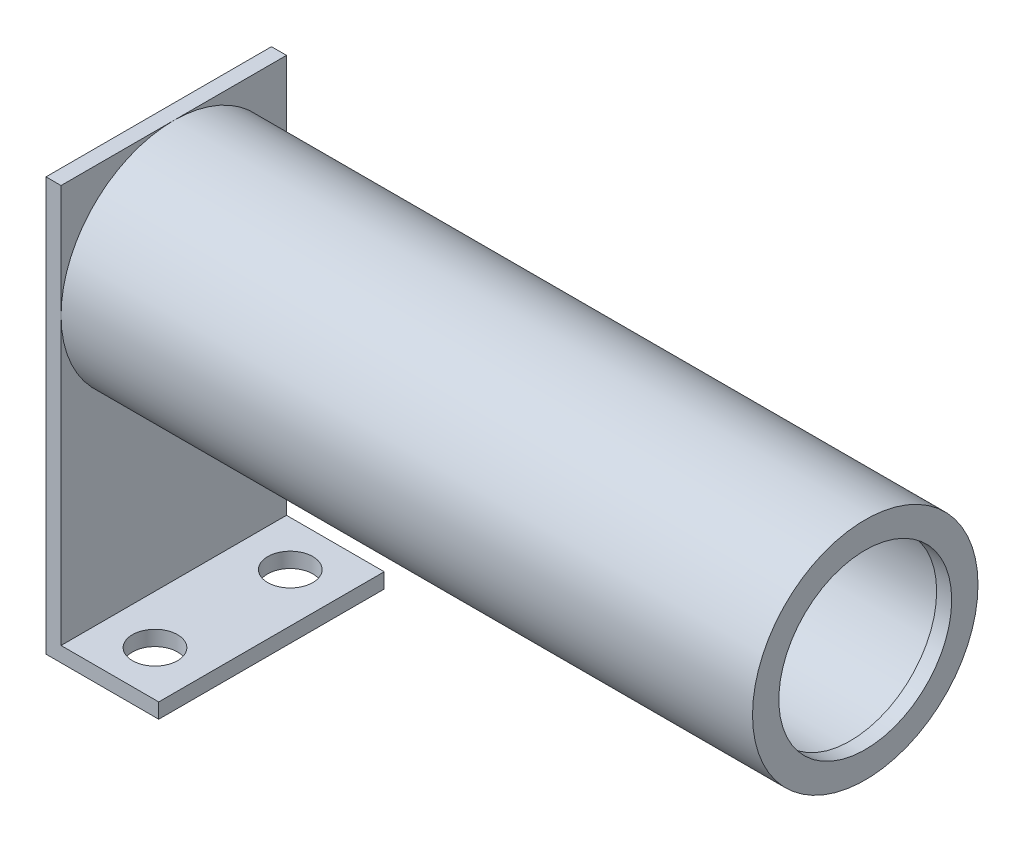
ISO-10303-21;
HEADER;
FILE_DESCRIPTION(('STEP AP214'),'2;1');
FILE_NAME('part.step','',(''),(''),'','','');
FILE_SCHEMA(('AUTOMOTIVE_DESIGN { 1 0 10303 214 1 1 1 1 }'));
ENDSEC;
DATA;
#1=APPLICATION_CONTEXT('core data for automotive mechanical design processes');
#2=APPLICATION_PROTOCOL_DEFINITION('international standard','automotive_design',2000,#1);
#3=PRODUCT_CONTEXT('',#1,'mechanical');
#4=PRODUCT('Part','Part','',(#3));
#5=PRODUCT_RELATED_PRODUCT_CATEGORY('part','',(#4));
#6=PRODUCT_DEFINITION_FORMATION('','',#4);
#7=PRODUCT_DEFINITION_CONTEXT('part definition',#1,'design');
#8=PRODUCT_DEFINITION('design','',#6,#7);
#9=PRODUCT_DEFINITION_SHAPE('','',#8);
#10=(LENGTH_UNIT() NAMED_UNIT(*) SI_UNIT(.MILLI.,.METRE.));
#11=(NAMED_UNIT(*) PLANE_ANGLE_UNIT() SI_UNIT($,.RADIAN.));
#12=(NAMED_UNIT(*) SI_UNIT($,.STERADIAN.) SOLID_ANGLE_UNIT());
#13=UNCERTAINTY_MEASURE_WITH_UNIT(LENGTH_MEASURE(1.E-05),#10,'distance_accuracy_value','');
#14=(GEOMETRIC_REPRESENTATION_CONTEXT(3) GLOBAL_UNCERTAINTY_ASSIGNED_CONTEXT((#13)) GLOBAL_UNIT_ASSIGNED_CONTEXT((#10,
#11,#12)) REPRESENTATION_CONTEXT('',''));
#15=CARTESIAN_POINT('',(0.,0.,0.));
#16=DIRECTION('',(0.,0.,1.));
#17=DIRECTION('',(1.,0.,0.));
#18=AXIS2_PLACEMENT_3D('',#15,#16,#17);
#19=CARTESIAN_POINT('',(-5.5,55.,-15.));
#20=DIRECTION('',(-1.,0.,0.));
#21=DIRECTION('',(0.,0.,1.));
#22=AXIS2_PLACEMENT_3D('',#19,#20,#21);
#23=PLANE('',#22);
#24=CARTESIAN_POINT('',(-5.5,40.,0.));
#25=DIRECTION('',(1.,0.,0.));
#26=DIRECTION('',(0.,0.,-1.));
#27=AXIS2_PLACEMENT_3D('',#24,#25,#26);
#28=CIRCLE('',#27,15.);
#29=CARTESIAN_POINT('',(-5.5,40.,15.));
#30=VERTEX_POINT('',#29);
#31=CARTESIAN_POINT('',(-5.50000000000001,40.,-15.));
#32=VERTEX_POINT('',#31);
#33=EDGE_CURVE('E124',#30,#32,#28,.T.);
#34=ORIENTED_EDGE('',*,*,#33,.F.);
#35=DIRECTION('',(0.,-1.,0.));
#36=VECTOR('',#35,1.);
#37=CARTESIAN_POINT('',(-5.5,55.,15.));
#38=LINE('',#37,#36);
#39=CARTESIAN_POINT('',(-5.5,2.,15.));
#40=VERTEX_POINT('',#39);
#41=EDGE_CURVE('E112',#30,#40,#38,.T.);
#42=ORIENTED_EDGE('',*,*,#41,.T.);
#43=DIRECTION('',(0.,0.,-1.));
#44=VECTOR('',#43,1.);
#45=CARTESIAN_POINT('',(-5.5,2.,-15.));
#46=LINE('',#45,#44);
#47=CARTESIAN_POINT('',(-5.5,2.,-15.));
#48=VERTEX_POINT('',#47);
#49=EDGE_CURVE('E139',#40,#48,#46,.T.);
#50=ORIENTED_EDGE('',*,*,#49,.T.);
#51=DIRECTION('',(0.,-1.,0.));
#52=VECTOR('',#51,1.);
#53=CARTESIAN_POINT('',(-5.5,55.,-15.));
#54=LINE('',#53,#52);
#55=EDGE_CURVE('E125',#32,#48,#54,.T.);
#56=ORIENTED_EDGE('',*,*,#55,.F.);
#57=EDGE_LOOP('',(#34,#42,#50,#56));
#58=FACE_BOUND('',#57,.T.);
#59=ADVANCED_FACE('F40',(#58),#23,.F.);
#60=CARTESIAN_POINT('',(-5.5,55.,0.));
#61=VERTEX_POINT('',#60);
#62=EDGE_CURVE('E57',#32,#61,#28,.T.);
#63=ORIENTED_EDGE('',*,*,#62,.F.);
#64=CARTESIAN_POINT('',(-5.5,55.,-15.));
#65=VERTEX_POINT('',#64);
#66=EDGE_CURVE('E122',#65,#32,#54,.T.);
#67=ORIENTED_EDGE('',*,*,#66,.F.);
#68=DIRECTION('',(0.,0.,-1.));
#69=VECTOR('',#68,1.);
#70=CARTESIAN_POINT('',(-5.5,55.,-15.));
#71=LINE('',#70,#69);
#72=EDGE_CURVE('E141',#61,#65,#71,.T.);
#73=ORIENTED_EDGE('',*,*,#72,.F.);
#74=EDGE_LOOP('',(#63,#67,#73));
#75=FACE_BOUND('',#74,.T.);
#76=ADVANCED_FACE('F218',(#75),#23,.F.);
#77=CARTESIAN_POINT('',(-7.5,2.,15.));
#78=DIRECTION('',(1.,0.,0.));
#79=DIRECTION('',(0.,0.,-1.));
#80=AXIS2_PLACEMENT_3D('',#77,#78,#79);
#81=PLANE('',#80);
#82=DIRECTION('',(0.,0.,1.));
#83=VECTOR('',#82,1.);
#84=CARTESIAN_POINT('',(-7.5,0.,15.));
#85=LINE('',#84,#83);
#86=CARTESIAN_POINT('',(-7.5,0.,-15.));
#87=VERTEX_POINT('',#86);
#88=CARTESIAN_POINT('',(-7.5,0.,15.));
#89=VERTEX_POINT('',#88);
#90=EDGE_CURVE('E111',#87,#89,#85,.T.);
#91=ORIENTED_EDGE('',*,*,#90,.T.);
#92=DIRECTION('',(0.,-1.,0.));
#93=VECTOR('',#92,1.);
#94=CARTESIAN_POINT('',(-7.5,2.,15.));
#95=LINE('',#94,#93);
#96=CARTESIAN_POINT('',(-7.5,55.,15.));
#97=VERTEX_POINT('',#96);
#98=EDGE_CURVE('E11',#97,#89,#95,.T.);
#99=ORIENTED_EDGE('',*,*,#98,.F.);
#100=DIRECTION('',(0.,0.,1.));
#101=VECTOR('',#100,1.);
#102=CARTESIAN_POINT('',(-7.5,55.,15.));
#103=LINE('',#102,#101);
#104=CARTESIAN_POINT('',(-7.5,55.,-15.));
#105=VERTEX_POINT('',#104);
#106=EDGE_CURVE('E135',#105,#97,#103,.T.);
#107=ORIENTED_EDGE('',*,*,#106,.F.);
#108=DIRECTION('',(0.,-1.,0.));
#109=VECTOR('',#108,1.);
#110=CARTESIAN_POINT('',(-7.5,2.,-15.));
#111=LINE('',#110,#109);
#112=EDGE_CURVE('E155',#105,#87,#111,.T.);
#113=ORIENTED_EDGE('',*,*,#112,.T.);
#114=EDGE_LOOP('',(#91,#99,#107,#113));
#115=FACE_BOUND('',#114,.T.);
#116=ADVANCED_FACE('F42',(#115),#81,.F.);
#117=CARTESIAN_POINT('',(7.5,2.,15.));
#118=DIRECTION('',(0.,0.,-1.));
#119=DIRECTION('',(-1.,0.,0.));
#120=AXIS2_PLACEMENT_3D('',#117,#118,#119);
#121=PLANE('',#120);
#122=DIRECTION('',(1.,0.,0.));
#123=VECTOR('',#122,1.);
#124=CARTESIAN_POINT('',(7.5,0.,15.));
#125=LINE('',#124,#123);
#126=CARTESIAN_POINT('',(7.5,0.,15.));
#127=VERTEX_POINT('',#126);
#128=EDGE_CURVE('E158',#89,#127,#125,.T.);
#129=ORIENTED_EDGE('',*,*,#128,.T.);
#130=DIRECTION('',(0.,-1.,0.));
#131=VECTOR('',#130,1.);
#132=CARTESIAN_POINT('',(7.5,2.,15.));
#133=LINE('',#132,#131);
#134=CARTESIAN_POINT('',(7.5,2.,15.));
#135=VERTEX_POINT('',#134);
#136=EDGE_CURVE('E49',#135,#127,#133,.T.);
#137=ORIENTED_EDGE('',*,*,#136,.F.);
#138=DIRECTION('',(1.,0.,0.));
#139=VECTOR('',#138,1.);
#140=CARTESIAN_POINT('',(7.5,2.,15.));
#141=LINE('',#140,#139);
#142=EDGE_CURVE('E118',#40,#135,#141,.T.);
#143=ORIENTED_EDGE('',*,*,#142,.F.);
#144=ORIENTED_EDGE('',*,*,#41,.F.);
#145=CARTESIAN_POINT('',(-5.5,55.,15.));
#146=VERTEX_POINT('',#145);
#147=EDGE_CURVE('E104',#146,#30,#38,.T.);
#148=ORIENTED_EDGE('',*,*,#147,.F.);
#149=DIRECTION('',(1.,0.,0.));
#150=VECTOR('',#149,1.);
#151=CARTESIAN_POINT('',(-5.5,55.,15.));
#152=LINE('',#151,#150);
#153=EDGE_CURVE('E138',#97,#146,#152,.T.);
#154=ORIENTED_EDGE('',*,*,#153,.F.);
#155=ORIENTED_EDGE('',*,*,#98,.T.);
#156=EDGE_LOOP('',(#129,#137,#143,#144,#148,#154,#155));
#157=FACE_BOUND('',#156,.T.);
#158=ADVANCED_FACE('F116',(#157),#121,.F.);
#159=CARTESIAN_POINT('',(7.5,2.,15.));
#160=DIRECTION('',(-1.,0.,0.));
#161=DIRECTION('',(0.,0.,1.));
#162=AXIS2_PLACEMENT_3D('',#159,#160,#161);
#163=PLANE('',#162);
#164=DIRECTION('',(0.,0.,-1.));
#165=VECTOR('',#164,1.);
#166=CARTESIAN_POINT('',(7.5,0.,15.));
#167=LINE('',#166,#165);
#168=CARTESIAN_POINT('',(7.5,0.,-15.));
#169=VERTEX_POINT('',#168);
#170=EDGE_CURVE('E160',#127,#169,#167,.T.);
#171=ORIENTED_EDGE('',*,*,#170,.T.);
#172=DIRECTION('',(0.,-1.,0.));
#173=VECTOR('',#172,1.);
#174=CARTESIAN_POINT('',(7.5,2.,-15.));
#175=LINE('',#174,#173);
#176=CARTESIAN_POINT('',(7.5,2.,-15.));
#177=VERTEX_POINT('',#176);
#178=EDGE_CURVE('E165',#177,#169,#175,.T.);
#179=ORIENTED_EDGE('',*,*,#178,.F.);
#180=DIRECTION('',(0.,0.,-1.));
#181=VECTOR('',#180,1.);
#182=CARTESIAN_POINT('',(7.5,2.,15.));
#183=LINE('',#182,#181);
#184=EDGE_CURVE('E149',#135,#177,#183,.T.);
#185=ORIENTED_EDGE('',*,*,#184,.F.);
#186=ORIENTED_EDGE('',*,*,#136,.T.);
#187=EDGE_LOOP('',(#171,#179,#185,#186));
#188=FACE_BOUND('',#187,.T.);
#189=ADVANCED_FACE('F312',(#188),#163,.F.);
#190=CARTESIAN_POINT('',(7.5,2.,-15.));
#191=DIRECTION('',(0.,0.,1.));
#192=DIRECTION('',(1.,0.,0.));
#193=AXIS2_PLACEMENT_3D('',#190,#191,#192);
#194=PLANE('',#193);
#195=DIRECTION('',(-1.,0.,0.));
#196=VECTOR('',#195,1.);
#197=CARTESIAN_POINT('',(7.5,0.,-15.));
#198=LINE('',#197,#196);
#199=EDGE_CURVE('E150',#169,#87,#198,.T.);
#200=ORIENTED_EDGE('',*,*,#199,.T.);
#201=ORIENTED_EDGE('',*,*,#112,.F.);
#202=DIRECTION('',(-1.,0.,0.));
#203=VECTOR('',#202,1.);
#204=CARTESIAN_POINT('',(-7.5,55.,-15.));
#205=LINE('',#204,#203);
#206=EDGE_CURVE('E143',#65,#105,#205,.T.);
#207=ORIENTED_EDGE('',*,*,#206,.F.);
#208=ORIENTED_EDGE('',*,*,#66,.T.);
#209=ORIENTED_EDGE('',*,*,#55,.T.);
#210=DIRECTION('',(-1.,0.,0.));
#211=VECTOR('',#210,1.);
#212=CARTESIAN_POINT('',(7.5,2.,-15.));
#213=LINE('',#212,#211);
#214=EDGE_CURVE('E152',#177,#48,#213,.T.);
#215=ORIENTED_EDGE('',*,*,#214,.F.);
#216=ORIENTED_EDGE('',*,*,#178,.T.);
#217=EDGE_LOOP('',(#200,#201,#207,#208,#209,#215,#216));
#218=FACE_BOUND('',#217,.T.);
#219=ADVANCED_FACE('F307',(#218),#194,.F.);
#220=CARTESIAN_POINT('',(0.,2.,0.));
#221=DIRECTION('',(0.,1.,0.));
#222=DIRECTION('',(0.,0.,1.));
#223=AXIS2_PLACEMENT_3D('',#220,#221,#222);
#224=PLANE('',#223);
#225=CARTESIAN_POINT('',(1.,2.,9.00000000000001));
#226=DIRECTION('',(0.,1.,0.));
#227=DIRECTION('',(0.,0.,1.));
#228=AXIS2_PLACEMENT_3D('',#225,#226,#227);
#229=CIRCLE('',#228,3.);
#230=CARTESIAN_POINT('',(1.,2.,12.));
#231=VERTEX_POINT('',#230);
#232=EDGE_CURVE('E171',#231,#231,#229,.T.);
#233=ORIENTED_EDGE('',*,*,#232,.F.);
#234=EDGE_LOOP('',(#233));
#235=FACE_BOUND('',#234,.T.);
#236=CARTESIAN_POINT('',(1.,2.,-9.00000000000001));
#237=DIRECTION('',(0.,1.,0.));
#238=DIRECTION('',(0.,0.,-1.));
#239=AXIS2_PLACEMENT_3D('',#236,#237,#238);
#240=CIRCLE('',#239,3.);
#241=CARTESIAN_POINT('',(1.,2.,-12.));
#242=VERTEX_POINT('',#241);
#243=EDGE_CURVE('E177',#242,#242,#240,.T.);
#244=ORIENTED_EDGE('',*,*,#243,.F.);
#245=EDGE_LOOP('',(#244));
#246=FACE_BOUND('',#245,.T.);
#247=ORIENTED_EDGE('',*,*,#49,.F.);
#248=ORIENTED_EDGE('',*,*,#142,.T.);
#249=ORIENTED_EDGE('',*,*,#184,.T.);
#250=ORIENTED_EDGE('',*,*,#214,.T.);
#251=EDGE_LOOP('',(#247,#248,#249,#250));
#252=FACE_BOUND('',#251,.T.);
#253=ADVANCED_FACE('F233',(#235,#246,#252),#224,.T.);
#254=CARTESIAN_POINT('',(0.,0.,0.));
#255=DIRECTION('',(0.,1.,0.));
#256=DIRECTION('',(0.,0.,1.));
#257=AXIS2_PLACEMENT_3D('',#254,#255,#256);
#258=PLANE('',#257);
#259=CARTESIAN_POINT('',(1.,0.,9.00000000000001));
#260=DIRECTION('',(0.,1.,0.));
#261=DIRECTION('',(0.,0.,1.));
#262=AXIS2_PLACEMENT_3D('',#259,#260,#261);
#263=CIRCLE('',#262,3.);
#264=CARTESIAN_POINT('',(1.,0.,12.));
#265=VERTEX_POINT('',#264);
#266=EDGE_CURVE('E44',#265,#265,#263,.T.);
#267=ORIENTED_EDGE('',*,*,#266,.T.);
#268=EDGE_LOOP('',(#267));
#269=FACE_BOUND('',#268,.T.);
#270=CARTESIAN_POINT('',(1.,0.,-9.00000000000001));
#271=DIRECTION('',(0.,1.,0.));
#272=DIRECTION('',(0.,0.,1.));
#273=AXIS2_PLACEMENT_3D('',#270,#271,#272);
#274=CIRCLE('',#273,3.);
#275=CARTESIAN_POINT('',(1.,0.,-6.00000000000001));
#276=VERTEX_POINT('',#275);
#277=EDGE_CURVE('E169',#276,#276,#274,.T.);
#278=ORIENTED_EDGE('',*,*,#277,.T.);
#279=EDGE_LOOP('',(#278));
#280=FACE_BOUND('',#279,.T.);
#281=ORIENTED_EDGE('',*,*,#90,.F.);
#282=ORIENTED_EDGE('',*,*,#199,.F.);
#283=ORIENTED_EDGE('',*,*,#170,.F.);
#284=ORIENTED_EDGE('',*,*,#128,.F.);
#285=EDGE_LOOP('',(#281,#282,#283,#284));
#286=FACE_BOUND('',#285,.T.);
#287=ADVANCED_FACE('F227',(#269,#280,#286),#258,.F.);
#288=EDGE_CURVE('E65',#61,#30,#28,.T.);
#289=ORIENTED_EDGE('',*,*,#288,.F.);
#290=EDGE_CURVE('E108',#146,#61,#71,.T.);
#291=ORIENTED_EDGE('',*,*,#290,.F.);
#292=ORIENTED_EDGE('',*,*,#147,.T.);
#293=EDGE_LOOP('',(#289,#291,#292));
#294=FACE_BOUND('',#293,.T.);
#295=ADVANCED_FACE('F106',(#294),#23,.F.);
#296=CARTESIAN_POINT('',(0.,55.,0.));
#297=DIRECTION('',(0.,-1.,0.));
#298=DIRECTION('',(0.,0.,-1.));
#299=AXIS2_PLACEMENT_3D('',#296,#297,#298);
#300=PLANE('',#299);
#301=ORIENTED_EDGE('',*,*,#106,.T.);
#302=ORIENTED_EDGE('',*,*,#153,.T.);
#303=ORIENTED_EDGE('',*,*,#290,.T.);
#304=ORIENTED_EDGE('',*,*,#72,.T.);
#305=ORIENTED_EDGE('',*,*,#206,.T.);
#306=EDGE_LOOP('',(#301,#302,#303,#304,#305));
#307=FACE_BOUND('',#306,.T.);
#308=ADVANCED_FACE('F226',(#307),#300,.F.);
#309=CARTESIAN_POINT('',(86.5,40.,0.));
#310=DIRECTION('',(1.,0.,0.));
#311=DIRECTION('',(0.,0.,-1.));
#312=AXIS2_PLACEMENT_3D('',#309,#310,#311);
#313=PLANE('',#312);
#314=CARTESIAN_POINT('',(86.5,40.,0.));
#315=DIRECTION('',(1.,0.,0.));
#316=DIRECTION('',(0.,0.,-1.));
#317=AXIS2_PLACEMENT_3D('',#314,#315,#316);
#318=CIRCLE('',#317,15.);
#319=CARTESIAN_POINT('',(86.5,40.,-15.));
#320=VERTEX_POINT('',#319);
#321=EDGE_CURVE('E131',#320,#320,#318,.T.);
#322=ORIENTED_EDGE('',*,*,#321,.T.);
#323=EDGE_LOOP('',(#322));
#324=FACE_BOUND('',#323,.T.);
#325=CARTESIAN_POINT('',(86.5,40.,0.));
#326=DIRECTION('',(1.,0.,0.));
#327=DIRECTION('',(0.,0.,-1.));
#328=AXIS2_PLACEMENT_3D('',#325,#326,#327);
#329=CIRCLE('',#328,11.5);
#330=CARTESIAN_POINT('',(86.5,40.,-11.5));
#331=VERTEX_POINT('',#330);
#332=EDGE_CURVE('E175',#331,#331,#329,.T.);
#333=ORIENTED_EDGE('',*,*,#332,.F.);
#334=EDGE_LOOP('',(#333));
#335=FACE_BOUND('',#334,.T.);
#336=ADVANCED_FACE('F214',(#324,#335),#313,.T.);
#337=CARTESIAN_POINT('',(86.5,40.,0.));
#338=DIRECTION('',(-1.,0.,0.));
#339=DIRECTION('',(0.,0.,1.));
#340=AXIS2_PLACEMENT_3D('',#337,#338,#339);
#341=CYLINDRICAL_SURFACE('',#340,15.);
#342=ORIENTED_EDGE('',*,*,#321,.F.);
#343=EDGE_LOOP('',(#342));
#344=FACE_BOUND('',#343,.T.);
#345=ORIENTED_EDGE('',*,*,#62,.T.);
#346=ORIENTED_EDGE('',*,*,#288,.T.);
#347=ORIENTED_EDGE('',*,*,#33,.T.);
#348=EDGE_LOOP('',(#345,#346,#347));
#349=FACE_BOUND('',#348,.T.);
#350=ADVANCED_FACE('F130',(#344,#349),#341,.T.);
#351=CARTESIAN_POINT('',(84.5,40.,0.));
#352=DIRECTION('',(1.,0.,0.));
#353=DIRECTION('',(0.,0.,-1.));
#354=AXIS2_PLACEMENT_3D('',#351,#352,#353);
#355=PLANE('',#354);
#356=CARTESIAN_POINT('',(84.5,40.,0.));
#357=DIRECTION('',(1.,0.,0.));
#358=DIRECTION('',(0.,0.,-1.));
#359=AXIS2_PLACEMENT_3D('',#356,#357,#358);
#360=CIRCLE('',#359,11.5);
#361=CARTESIAN_POINT('',(84.5,40.,-11.5));
#362=VERTEX_POINT('',#361);
#363=EDGE_CURVE('E184',#362,#362,#360,.T.);
#364=ORIENTED_EDGE('',*,*,#363,.T.);
#365=EDGE_LOOP('',(#364));
#366=FACE_BOUND('',#365,.T.);
#367=CARTESIAN_POINT('',(84.5,40.,0.));
#368=DIRECTION('',(1.,0.,0.));
#369=DIRECTION('',(0.,0.,-1.));
#370=AXIS2_PLACEMENT_3D('',#367,#368,#369);
#371=CIRCLE('',#370,12.5);
#372=CARTESIAN_POINT('',(84.5,40.,-12.5));
#373=VERTEX_POINT('',#372);
#374=EDGE_CURVE('E187',#373,#373,#371,.T.);
#375=ORIENTED_EDGE('',*,*,#374,.F.);
#376=EDGE_LOOP('',(#375));
#377=FACE_BOUND('',#376,.T.);
#378=ADVANCED_FACE('F203',(#366,#377),#355,.F.);
#379=CARTESIAN_POINT('',(84.5,40.,0.));
#380=DIRECTION('',(1.,0.,0.));
#381=DIRECTION('',(0.,0.,-1.));
#382=AXIS2_PLACEMENT_3D('',#379,#380,#381);
#383=CYLINDRICAL_SURFACE('',#382,11.5);
#384=ORIENTED_EDGE('',*,*,#363,.F.);
#385=EDGE_LOOP('',(#384));
#386=FACE_BOUND('',#385,.T.);
#387=ORIENTED_EDGE('',*,*,#332,.T.);
#388=EDGE_LOOP('',(#387));
#389=FACE_BOUND('',#388,.T.);
#390=ADVANCED_FACE('F205',(#386,#389),#383,.F.);
#391=CARTESIAN_POINT('',(-5.5,40.,0.));
#392=DIRECTION('',(1.,0.,0.));
#393=DIRECTION('',(0.,0.,-1.));
#394=AXIS2_PLACEMENT_3D('',#391,#392,#393);
#395=CIRCLE('',#394,12.5);
#396=CARTESIAN_POINT('',(-5.5,40.,-12.5));
#397=VERTEX_POINT('',#396);
#398=EDGE_CURVE('E128',#397,#397,#395,.T.);
#399=ORIENTED_EDGE('',*,*,#398,.T.);
#400=EDGE_LOOP('',(#399));
#401=FACE_BOUND('',#400,.T.);
#402=ADVANCED_FACE('F194',(#401),#23,.F.);
#403=CARTESIAN_POINT('',(86.5,40.,0.));
#404=DIRECTION('',(-1.,0.,0.));
#405=DIRECTION('',(0.,0.,1.));
#406=AXIS2_PLACEMENT_3D('',#403,#404,#405);
#407=CYLINDRICAL_SURFACE('',#406,12.5);
#408=ORIENTED_EDGE('',*,*,#398,.F.);
#409=EDGE_LOOP('',(#408));
#410=FACE_BOUND('',#409,.T.);
#411=ORIENTED_EDGE('',*,*,#374,.T.);
#412=EDGE_LOOP('',(#411));
#413=FACE_BOUND('',#412,.T.);
#414=ADVANCED_FACE('F196',(#410,#413),#407,.F.);
#415=CARTESIAN_POINT('',(1.,-8.,-9.00000000000001));
#416=DIRECTION('',(0.,1.,0.));
#417=DIRECTION('',(0.,0.,1.));
#418=AXIS2_PLACEMENT_3D('',#415,#416,#417);
#419=CYLINDRICAL_SURFACE('',#418,3.);
#420=ORIENTED_EDGE('',*,*,#243,.T.);
#421=EDGE_LOOP('',(#420));
#422=FACE_BOUND('',#421,.T.);
#423=ORIENTED_EDGE('',*,*,#277,.F.);
#424=EDGE_LOOP('',(#423));
#425=FACE_BOUND('',#424,.T.);
#426=ADVANCED_FACE('F199',(#422,#425),#419,.F.);
#427=CARTESIAN_POINT('',(1.,-8.,9.00000000000001));
#428=DIRECTION('',(0.,1.,0.));
#429=DIRECTION('',(0.,0.,1.));
#430=AXIS2_PLACEMENT_3D('',#427,#428,#429);
#431=CYLINDRICAL_SURFACE('',#430,3.);
#432=ORIENTED_EDGE('',*,*,#232,.T.);
#433=EDGE_LOOP('',(#432));
#434=FACE_BOUND('',#433,.T.);
#435=ORIENTED_EDGE('',*,*,#266,.F.);
#436=EDGE_LOOP('',(#435));
#437=FACE_BOUND('',#436,.T.);
#438=ADVANCED_FACE('F254',(#434,#437),#431,.F.);
#439=CLOSED_SHELL('',(#59,#76,#116,#158,#189,#219,#253,#287,#295,#308,#336,#350,#378,#390,#402,
#414,#426,#438));
#440=MANIFOLD_SOLID_BREP('B2',#439);
#441=ADVANCED_BREP_SHAPE_REPRESENTATION('',(#18,#440),#14);
#442=SHAPE_DEFINITION_REPRESENTATION(#9,#441);
ENDSEC;
END-ISO-10303-21;
